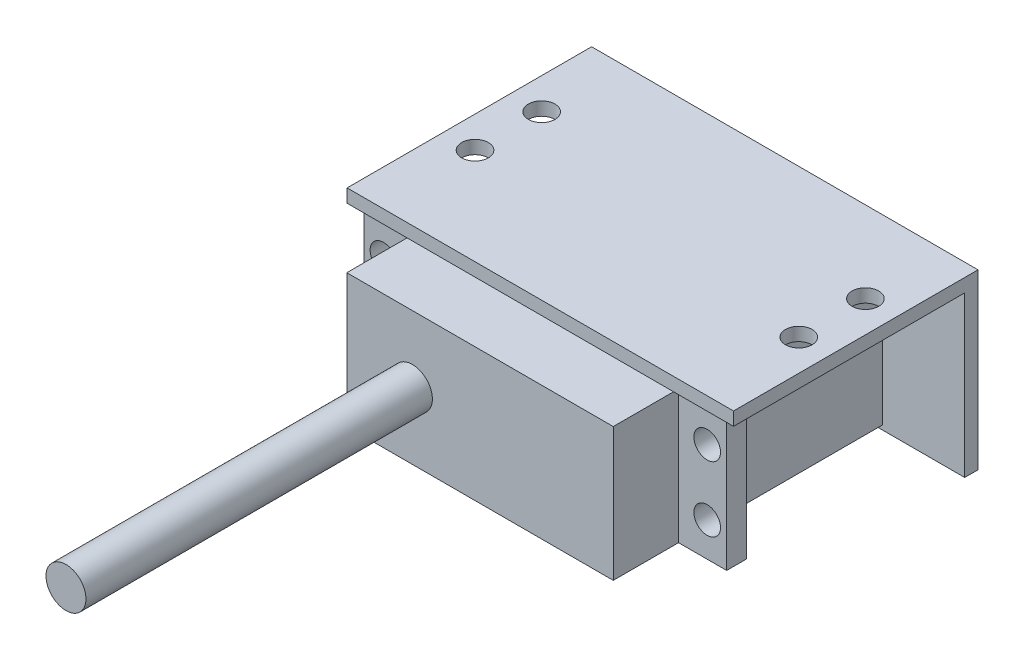
ISO-10303-21;
HEADER;
FILE_DESCRIPTION(('STEP AP214'),'2;1');
FILE_NAME('part.step','',(''),(''),'','','');
FILE_SCHEMA(('AUTOMOTIVE_DESIGN { 1 0 10303 214 1 1 1 1 }'));
ENDSEC;
DATA;
#1=APPLICATION_CONTEXT('core data for automotive mechanical design processes');
#2=APPLICATION_PROTOCOL_DEFINITION('international standard','automotive_design',2000,#1);
#3=PRODUCT_CONTEXT('',#1,'mechanical');
#4=PRODUCT('Part','Part','',(#3));
#5=PRODUCT_RELATED_PRODUCT_CATEGORY('part','',(#4));
#6=PRODUCT_DEFINITION_FORMATION('','',#4);
#7=PRODUCT_DEFINITION_CONTEXT('part definition',#1,'design');
#8=PRODUCT_DEFINITION('design','',#6,#7);
#9=PRODUCT_DEFINITION_SHAPE('','',#8);
#10=(LENGTH_UNIT() NAMED_UNIT(*) SI_UNIT(.MILLI.,.METRE.));
#11=(NAMED_UNIT(*) PLANE_ANGLE_UNIT() SI_UNIT($,.RADIAN.));
#12=(NAMED_UNIT(*) SI_UNIT($,.STERADIAN.) SOLID_ANGLE_UNIT());
#13=UNCERTAINTY_MEASURE_WITH_UNIT(LENGTH_MEASURE(1.E-05),#10,'distance_accuracy_value','');
#14=(GEOMETRIC_REPRESENTATION_CONTEXT(3) GLOBAL_UNCERTAINTY_ASSIGNED_CONTEXT((#13)) GLOBAL_UNIT_ASSIGNED_CONTEXT((#10,
#11,#12)) REPRESENTATION_CONTEXT('',''));
#15=CARTESIAN_POINT('',(0.,0.,0.));
#16=DIRECTION('',(0.,0.,1.));
#17=DIRECTION('',(1.,0.,0.));
#18=AXIS2_PLACEMENT_3D('',#15,#16,#17);
#19=CARTESIAN_POINT('',(0.,10.,0.));
#20=DIRECTION('',(0.,1.,0.));
#21=DIRECTION('',(0.,0.,1.));
#22=AXIS2_PLACEMENT_3D('',#19,#20,#21);
#23=PLANE('',#22);
#24=CARTESIAN_POINT('',(24.3,10.,-23.55));
#25=DIRECTION('',(0.,1.,0.));
#26=DIRECTION('',(0.,0.,1.));
#27=AXIS2_PLACEMENT_3D('',#24,#25,#26);
#28=CIRCLE('',#27,2.00000000000001);
#29=CARTESIAN_POINT('',(24.3,10.,-21.55));
#30=VERTEX_POINT('',#29);
#31=EDGE_CURVE('E206',#30,#30,#28,.T.);
#32=ORIENTED_EDGE('',*,*,#31,.T.);
#33=EDGE_LOOP('',(#32));
#34=FACE_BOUND('',#33,.T.);
#35=CARTESIAN_POINT('',(24.3,10.,-33.55));
#36=DIRECTION('',(0.,1.,0.));
#37=DIRECTION('',(0.,0.,1.));
#38=AXIS2_PLACEMENT_3D('',#35,#36,#37);
#39=CIRCLE('',#38,2.00000000000001);
#40=CARTESIAN_POINT('',(24.3,10.,-31.55));
#41=VERTEX_POINT('',#40);
#42=EDGE_CURVE('E210',#41,#41,#39,.T.);
#43=ORIENTED_EDGE('',*,*,#42,.T.);
#44=EDGE_LOOP('',(#43));
#45=FACE_BOUND('',#44,.T.);
#46=CARTESIAN_POINT('',(-24.3,10.,-23.55));
#47=DIRECTION('',(0.,1.,0.));
#48=DIRECTION('',(0.,0.,1.));
#49=AXIS2_PLACEMENT_3D('',#46,#47,#48);
#50=CIRCLE('',#49,2.00000000000001);
#51=CARTESIAN_POINT('',(-24.3,10.,-21.55));
#52=VERTEX_POINT('',#51);
#53=EDGE_CURVE('E216',#52,#52,#50,.T.);
#54=ORIENTED_EDGE('',*,*,#53,.T.);
#55=EDGE_LOOP('',(#54));
#56=FACE_BOUND('',#55,.T.);
#57=CARTESIAN_POINT('',(-24.3,10.,-33.55));
#58=DIRECTION('',(0.,1.,0.));
#59=DIRECTION('',(0.,0.,1.));
#60=AXIS2_PLACEMENT_3D('',#57,#58,#59);
#61=CIRCLE('',#60,2.00000000000001);
#62=CARTESIAN_POINT('',(-24.3,10.,-31.55));
#63=VERTEX_POINT('',#62);
#64=EDGE_CURVE('E222',#63,#63,#61,.T.);
#65=ORIENTED_EDGE('',*,*,#64,.T.);
#66=EDGE_LOOP('',(#65));
#67=FACE_BOUND('',#66,.T.);
#68=DIRECTION('',(-1.,0.,0.));
#69=VECTOR('',#68,1.);
#70=CARTESIAN_POINT('',(-29.,10.,-43.75));
#71=LINE('',#70,#69);
#72=CARTESIAN_POINT('',(29.,10.,-43.75));
#73=VERTEX_POINT('',#72);
#74=CARTESIAN_POINT('',(-29.,10.,-43.75));
#75=VERTEX_POINT('',#74);
#76=EDGE_CURVE('E197',#73,#75,#71,.T.);
#77=ORIENTED_EDGE('',*,*,#76,.F.);
#78=DIRECTION('',(0.,0.,-1.));
#79=VECTOR('',#78,1.);
#80=CARTESIAN_POINT('',(29.,10.,-45.75));
#81=LINE('',#80,#79);
#82=CARTESIAN_POINT('',(29.,10.,-9.05));
#83=VERTEX_POINT('',#82);
#84=EDGE_CURVE('E228',#83,#73,#81,.T.);
#85=ORIENTED_EDGE('',*,*,#84,.F.);
#86=DIRECTION('',(1.,0.,0.));
#87=VECTOR('',#86,1.);
#88=CARTESIAN_POINT('',(-29.,10.,-9.05));
#89=LINE('',#88,#87);
#90=CARTESIAN_POINT('',(20.,10.,-9.05));
#91=VERTEX_POINT('',#90);
#92=EDGE_CURVE('E53',#91,#83,#89,.T.);
#93=ORIENTED_EDGE('',*,*,#92,.F.);
#94=DIRECTION('',(0.,0.,1.));
#95=VECTOR('',#94,1.);
#96=CARTESIAN_POINT('',(20.,10.,-40.45));
#97=LINE('',#96,#95);
#98=CARTESIAN_POINT('',(20.,10.,-9.8));
#99=VERTEX_POINT('',#98);
#100=EDGE_CURVE('E370',#99,#91,#97,.T.);
#101=ORIENTED_EDGE('',*,*,#100,.F.);
#102=DIRECTION('',(1.,0.,0.));
#103=VECTOR('',#102,1.);
#104=CARTESIAN_POINT('',(0.,10.,-9.8));
#105=LINE('',#104,#103);
#106=CARTESIAN_POINT('',(27.22,10.,-9.8));
#107=VERTEX_POINT('',#106);
#108=EDGE_CURVE('E264',#99,#107,#105,.T.);
#109=ORIENTED_EDGE('',*,*,#108,.T.);
#110=DIRECTION('',(0.,0.,-1.));
#111=VECTOR('',#110,1.);
#112=CARTESIAN_POINT('',(27.22,10.,-9.8));
#113=LINE('',#112,#111);
#114=CARTESIAN_POINT('',(27.22,10.,-12.8));
#115=VERTEX_POINT('',#114);
#116=EDGE_CURVE('E275',#107,#115,#113,.T.);
#117=ORIENTED_EDGE('',*,*,#116,.T.);
#118=DIRECTION('',(1.,0.,0.));
#119=VECTOR('',#118,1.);
#120=CARTESIAN_POINT('',(0.,10.,-12.8));
#121=LINE('',#120,#119);
#122=CARTESIAN_POINT('',(20.,10.,-12.8));
#123=VERTEX_POINT('',#122);
#124=EDGE_CURVE('E281',#123,#115,#121,.T.);
#125=ORIENTED_EDGE('',*,*,#124,.F.);
#126=CARTESIAN_POINT('',(20.,10.,-40.45));
#127=VERTEX_POINT('',#126);
#128=EDGE_CURVE('E45',#127,#123,#97,.T.);
#129=ORIENTED_EDGE('',*,*,#128,.F.);
#130=DIRECTION('',(1.,0.,0.));
#131=VECTOR('',#130,1.);
#132=CARTESIAN_POINT('',(0.,10.,-40.45));
#133=LINE('',#132,#131);
#134=CARTESIAN_POINT('',(-20.,10.,-40.45));
#135=VERTEX_POINT('',#134);
#136=EDGE_CURVE('E335',#135,#127,#133,.T.);
#137=ORIENTED_EDGE('',*,*,#136,.F.);
#138=DIRECTION('',(0.,0.,1.));
#139=VECTOR('',#138,1.);
#140=CARTESIAN_POINT('',(-20.,10.,-40.45));
#141=LINE('',#140,#139);
#142=CARTESIAN_POINT('',(-20.,10.,-12.8));
#143=VERTEX_POINT('',#142);
#144=EDGE_CURVE('E361',#135,#143,#141,.T.);
#145=ORIENTED_EDGE('',*,*,#144,.T.);
#146=DIRECTION('',(1.,0.,0.));
#147=VECTOR('',#146,1.);
#148=CARTESIAN_POINT('',(0.,10.,-12.8));
#149=LINE('',#148,#147);
#150=CARTESIAN_POINT('',(-27.22,10.,-12.8));
#151=VERTEX_POINT('',#150);
#152=EDGE_CURVE('E322',#151,#143,#149,.T.);
#153=ORIENTED_EDGE('',*,*,#152,.F.);
#154=DIRECTION('',(0.,0.,-1.));
#155=VECTOR('',#154,1.);
#156=CARTESIAN_POINT('',(-27.22,10.,-9.8));
#157=LINE('',#156,#155);
#158=CARTESIAN_POINT('',(-27.22,10.,-9.8));
#159=VERTEX_POINT('',#158);
#160=EDGE_CURVE('E330',#159,#151,#157,.T.);
#161=ORIENTED_EDGE('',*,*,#160,.F.);
#162=DIRECTION('',(1.,0.,0.));
#163=VECTOR('',#162,1.);
#164=CARTESIAN_POINT('',(0.,10.,-9.8));
#165=LINE('',#164,#163);
#166=CARTESIAN_POINT('',(-20.,10.,-9.8));
#167=VERTEX_POINT('',#166);
#168=EDGE_CURVE('E305',#159,#167,#165,.T.);
#169=ORIENTED_EDGE('',*,*,#168,.T.);
#170=CARTESIAN_POINT('',(-20.,10.,-9.05));
#171=VERTEX_POINT('',#170);
#172=EDGE_CURVE('E363',#167,#171,#141,.T.);
#173=ORIENTED_EDGE('',*,*,#172,.T.);
#174=CARTESIAN_POINT('',(-29.,10.,-9.05));
#175=VERTEX_POINT('',#174);
#176=EDGE_CURVE('E52',#175,#171,#89,.T.);
#177=ORIENTED_EDGE('',*,*,#176,.F.);
#178=DIRECTION('',(0.,0.,1.));
#179=VECTOR('',#178,1.);
#180=CARTESIAN_POINT('',(-29.,10.,-45.75));
#181=LINE('',#180,#179);
#182=EDGE_CURVE('E242',#75,#175,#181,.T.);
#183=ORIENTED_EDGE('',*,*,#182,.F.);
#184=EDGE_LOOP('',(#77,#85,#93,#101,#109,#117,#125,#129,#137,#145,#153,#161,#169,#173,#177,#183));
#185=FACE_BOUND('',#184,.T.);
#186=ADVANCED_FACE('F41',(#34,#45,#56,#67,#185),#23,.F.);
#187=CARTESIAN_POINT('',(0.,10.,-40.45));
#188=DIRECTION('',(0.,-1.,0.));
#189=DIRECTION('',(0.,0.,-1.));
#190=AXIS2_PLACEMENT_3D('',#187,#188,#189);
#191=PLANE('',#190);
#192=EDGE_CURVE('E11',#171,#91,#89,.T.);
#193=ORIENTED_EDGE('',*,*,#192,.F.);
#194=CARTESIAN_POINT('',(-20.,10.,0.));
#195=VERTEX_POINT('',#194);
#196=EDGE_CURVE('E364',#171,#195,#141,.T.);
#197=ORIENTED_EDGE('',*,*,#196,.T.);
#198=DIRECTION('',(1.,0.,0.));
#199=VECTOR('',#198,1.);
#200=CARTESIAN_POINT('',(0.,10.,0.));
#201=LINE('',#200,#199);
#202=CARTESIAN_POINT('',(20.,10.,0.));
#203=VERTEX_POINT('',#202);
#204=EDGE_CURVE('E347',#195,#203,#201,.T.);
#205=ORIENTED_EDGE('',*,*,#204,.T.);
#206=EDGE_CURVE('E344',#91,#203,#97,.T.);
#207=ORIENTED_EDGE('',*,*,#206,.F.);
#208=EDGE_LOOP('',(#193,#197,#205,#207));
#209=FACE_BOUND('',#208,.T.);
#210=ADVANCED_FACE('F380',(#209),#191,.F.);
#211=CARTESIAN_POINT('',(20.,0.,-40.45));
#212=DIRECTION('',(-1.,0.,0.));
#213=DIRECTION('',(0.,0.,1.));
#214=AXIS2_PLACEMENT_3D('',#211,#212,#213);
#215=PLANE('',#214);
#216=DIRECTION('',(0.,-1.,0.));
#217=VECTOR('',#216,1.);
#218=CARTESIAN_POINT('',(20.,0.,-9.8));
#219=LINE('',#218,#217);
#220=CARTESIAN_POINT('',(20.,-10.,-9.8));
#221=VERTEX_POINT('',#220);
#222=EDGE_CURVE('E267',#99,#221,#219,.T.);
#223=ORIENTED_EDGE('',*,*,#222,.F.);
#224=ORIENTED_EDGE('',*,*,#100,.T.);
#225=ORIENTED_EDGE('',*,*,#206,.T.);
#226=DIRECTION('',(0.,-1.,0.));
#227=VECTOR('',#226,1.);
#228=CARTESIAN_POINT('',(20.,0.,0.));
#229=LINE('',#228,#227);
#230=CARTESIAN_POINT('',(20.,-10.,0.));
#231=VERTEX_POINT('',#230);
#232=EDGE_CURVE('E332',#203,#231,#229,.T.);
#233=ORIENTED_EDGE('',*,*,#232,.T.);
#234=DIRECTION('',(0.,0.,1.));
#235=VECTOR('',#234,1.);
#236=CARTESIAN_POINT('',(20.,-10.,-40.45));
#237=LINE('',#236,#235);
#238=EDGE_CURVE('E357',#221,#231,#237,.T.);
#239=ORIENTED_EDGE('',*,*,#238,.F.);
#240=EDGE_LOOP('',(#223,#224,#225,#233,#239));
#241=FACE_BOUND('',#240,.T.);
#242=ADVANCED_FACE('F376',(#241),#215,.F.);
#243=CARTESIAN_POINT('',(-20.,0.,-40.45));
#244=DIRECTION('',(-1.,0.,0.));
#245=DIRECTION('',(0.,0.,1.));
#246=AXIS2_PLACEMENT_3D('',#243,#244,#245);
#247=PLANE('',#246);
#248=ORIENTED_EDGE('',*,*,#172,.F.);
#249=DIRECTION('',(0.,-1.,0.));
#250=VECTOR('',#249,1.);
#251=CARTESIAN_POINT('',(-20.,0.,-9.8));
#252=LINE('',#251,#250);
#253=CARTESIAN_POINT('',(-20.,-10.,-9.8));
#254=VERTEX_POINT('',#253);
#255=EDGE_CURVE('E302',#167,#254,#252,.T.);
#256=ORIENTED_EDGE('',*,*,#255,.T.);
#257=DIRECTION('',(0.,0.,1.));
#258=VECTOR('',#257,1.);
#259=CARTESIAN_POINT('',(-20.,-10.,-40.45));
#260=LINE('',#259,#258);
#261=CARTESIAN_POINT('',(-20.,-10.,0.));
#262=VERTEX_POINT('',#261);
#263=EDGE_CURVE('E360',#254,#262,#260,.T.);
#264=ORIENTED_EDGE('',*,*,#263,.T.);
#265=DIRECTION('',(0.,-1.,0.));
#266=VECTOR('',#265,1.);
#267=CARTESIAN_POINT('',(-20.,0.,0.));
#268=LINE('',#267,#266);
#269=EDGE_CURVE('E350',#195,#262,#268,.T.);
#270=ORIENTED_EDGE('',*,*,#269,.F.);
#271=ORIENTED_EDGE('',*,*,#196,.F.);
#272=EDGE_LOOP('',(#248,#256,#264,#270,#271));
#273=FACE_BOUND('',#272,.T.);
#274=ADVANCED_FACE('F406',(#273),#247,.T.);
#275=ORIENTED_EDGE('',*,*,#128,.T.);
#276=DIRECTION('',(0.,-1.,0.));
#277=VECTOR('',#276,1.);
#278=CARTESIAN_POINT('',(20.,0.,-12.8));
#279=LINE('',#278,#277);
#280=CARTESIAN_POINT('',(20.,-10.,-12.8));
#281=VERTEX_POINT('',#280);
#282=EDGE_CURVE('E283',#123,#281,#279,.T.);
#283=ORIENTED_EDGE('',*,*,#282,.T.);
#284=CARTESIAN_POINT('',(20.,-10.,-40.45));
#285=VERTEX_POINT('',#284);
#286=EDGE_CURVE('E50',#285,#281,#237,.T.);
#287=ORIENTED_EDGE('',*,*,#286,.F.);
#288=DIRECTION('',(0.,-1.,0.));
#289=VECTOR('',#288,1.);
#290=CARTESIAN_POINT('',(20.,0.,-40.45));
#291=LINE('',#290,#289);
#292=EDGE_CURVE('E333',#127,#285,#291,.T.);
#293=ORIENTED_EDGE('',*,*,#292,.F.);
#294=EDGE_LOOP('',(#275,#283,#287,#293));
#295=FACE_BOUND('',#294,.T.);
#296=ADVANCED_FACE('F43',(#295),#215,.F.);
#297=CARTESIAN_POINT('',(0.,-10.,-40.45));
#298=DIRECTION('',(0.,-1.,0.));
#299=DIRECTION('',(0.,0.,-1.));
#300=AXIS2_PLACEMENT_3D('',#297,#298,#299);
#301=PLANE('',#300);
#302=DIRECTION('',(1.,0.,0.));
#303=VECTOR('',#302,1.);
#304=CARTESIAN_POINT('',(0.,-10.,0.));
#305=LINE('',#304,#303);
#306=EDGE_CURVE('E336',#262,#231,#305,.T.);
#307=ORIENTED_EDGE('',*,*,#306,.F.);
#308=ORIENTED_EDGE('',*,*,#263,.F.);
#309=DIRECTION('',(1.,0.,0.));
#310=VECTOR('',#309,1.);
#311=CARTESIAN_POINT('',(0.,-10.,-9.8));
#312=LINE('',#311,#310);
#313=CARTESIAN_POINT('',(-27.22,-10.,-9.8));
#314=VERTEX_POINT('',#313);
#315=EDGE_CURVE('E311',#314,#254,#312,.T.);
#316=ORIENTED_EDGE('',*,*,#315,.F.);
#317=DIRECTION('',(0.,0.,-1.));
#318=VECTOR('',#317,1.);
#319=CARTESIAN_POINT('',(-27.22,-10.,-9.8));
#320=LINE('',#319,#318);
#321=CARTESIAN_POINT('',(-27.22,-10.,-12.8));
#322=VERTEX_POINT('',#321);
#323=EDGE_CURVE('E313',#314,#322,#320,.T.);
#324=ORIENTED_EDGE('',*,*,#323,.T.);
#325=DIRECTION('',(1.,0.,0.));
#326=VECTOR('',#325,1.);
#327=CARTESIAN_POINT('',(0.,-10.,-12.8));
#328=LINE('',#327,#326);
#329=CARTESIAN_POINT('',(-20.,-10.,-12.8));
#330=VERTEX_POINT('',#329);
#331=EDGE_CURVE('E299',#322,#330,#328,.T.);
#332=ORIENTED_EDGE('',*,*,#331,.T.);
#333=CARTESIAN_POINT('',(-20.,-10.,-40.45));
#334=VERTEX_POINT('',#333);
#335=EDGE_CURVE('E358',#334,#330,#260,.T.);
#336=ORIENTED_EDGE('',*,*,#335,.F.);
#337=DIRECTION('',(1.,0.,0.));
#338=VECTOR('',#337,1.);
#339=CARTESIAN_POINT('',(0.,-10.,-40.45));
#340=LINE('',#339,#338);
#341=EDGE_CURVE('E341',#334,#285,#340,.T.);
#342=ORIENTED_EDGE('',*,*,#341,.T.);
#343=ORIENTED_EDGE('',*,*,#286,.T.);
#344=DIRECTION('',(1.,0.,0.));
#345=VECTOR('',#344,1.);
#346=CARTESIAN_POINT('',(0.,-10.,-12.8));
#347=LINE('',#346,#345);
#348=CARTESIAN_POINT('',(27.22,-10.,-12.8));
#349=VERTEX_POINT('',#348);
#350=EDGE_CURVE('E285',#281,#349,#347,.T.);
#351=ORIENTED_EDGE('',*,*,#350,.T.);
#352=DIRECTION('',(0.,0.,-1.));
#353=VECTOR('',#352,1.);
#354=CARTESIAN_POINT('',(27.22,-10.,-9.8));
#355=LINE('',#354,#353);
#356=CARTESIAN_POINT('',(27.22,-10.,-9.8));
#357=VERTEX_POINT('',#356);
#358=EDGE_CURVE('E292',#357,#349,#355,.T.);
#359=ORIENTED_EDGE('',*,*,#358,.F.);
#360=DIRECTION('',(1.,0.,0.));
#361=VECTOR('',#360,1.);
#362=CARTESIAN_POINT('',(0.,-10.,-9.8));
#363=LINE('',#362,#361);
#364=EDGE_CURVE('E270',#221,#357,#363,.T.);
#365=ORIENTED_EDGE('',*,*,#364,.F.);
#366=ORIENTED_EDGE('',*,*,#238,.T.);
#367=EDGE_LOOP('',(#307,#308,#316,#324,#332,#336,#342,#343,#351,#359,#365,#366));
#368=FACE_BOUND('',#367,.T.);
#369=ADVANCED_FACE('F387',(#368),#301,.T.);
#370=DIRECTION('',(0.,-1.,0.));
#371=VECTOR('',#370,1.);
#372=CARTESIAN_POINT('',(-20.,0.,-12.8));
#373=LINE('',#372,#371);
#374=EDGE_CURVE('E319',#143,#330,#373,.T.);
#375=ORIENTED_EDGE('',*,*,#374,.F.);
#376=ORIENTED_EDGE('',*,*,#144,.F.);
#377=DIRECTION('',(0.,-1.,0.));
#378=VECTOR('',#377,1.);
#379=CARTESIAN_POINT('',(-20.,0.,-40.45));
#380=LINE('',#379,#378);
#381=EDGE_CURVE('E338',#135,#334,#380,.T.);
#382=ORIENTED_EDGE('',*,*,#381,.T.);
#383=ORIENTED_EDGE('',*,*,#335,.T.);
#384=EDGE_LOOP('',(#375,#376,#382,#383));
#385=FACE_BOUND('',#384,.T.);
#386=ADVANCED_FACE('F417',(#385),#247,.T.);
#387=CARTESIAN_POINT('',(0.,0.,-40.45));
#388=DIRECTION('',(0.,0.,1.));
#389=DIRECTION('',(1.,0.,0.));
#390=AXIS2_PLACEMENT_3D('',#387,#388,#389);
#391=PLANE('',#390);
#392=ORIENTED_EDGE('',*,*,#292,.T.);
#393=ORIENTED_EDGE('',*,*,#341,.F.);
#394=ORIENTED_EDGE('',*,*,#381,.F.);
#395=ORIENTED_EDGE('',*,*,#136,.T.);
#396=EDGE_LOOP('',(#392,#393,#394,#395));
#397=FACE_BOUND('',#396,.T.);
#398=ADVANCED_FACE('F423',(#397),#391,.F.);
#399=CARTESIAN_POINT('',(0.,0.,0.));
#400=DIRECTION('',(0.,0.,1.));
#401=DIRECTION('',(1.,0.,0.));
#402=AXIS2_PLACEMENT_3D('',#399,#400,#401);
#403=PLANE('',#402);
#404=CARTESIAN_POINT('',(-10.15,0.,0.));
#405=DIRECTION('',(0.,0.,1.));
#406=DIRECTION('',(1.,0.,0.));
#407=AXIS2_PLACEMENT_3D('',#404,#405,#406);
#408=CIRCLE('',#407,3.);
#409=CARTESIAN_POINT('',(-13.15,0.,0.));
#410=VERTEX_POINT('',#409);
#411=EDGE_CURVE('E250',#410,#410,#408,.T.);
#412=ORIENTED_EDGE('',*,*,#411,.F.);
#413=EDGE_LOOP('',(#412));
#414=FACE_BOUND('',#413,.T.);
#415=ORIENTED_EDGE('',*,*,#232,.F.);
#416=ORIENTED_EDGE('',*,*,#204,.F.);
#417=ORIENTED_EDGE('',*,*,#269,.T.);
#418=ORIENTED_EDGE('',*,*,#306,.T.);
#419=EDGE_LOOP('',(#415,#416,#417,#418));
#420=FACE_BOUND('',#419,.T.);
#421=ADVANCED_FACE('F383',(#414,#420),#403,.T.);
#422=CARTESIAN_POINT('',(-27.22,0.,-9.8));
#423=DIRECTION('',(1.,0.,0.));
#424=DIRECTION('',(0.,0.,-1.));
#425=AXIS2_PLACEMENT_3D('',#422,#423,#424);
#426=PLANE('',#425);
#427=DIRECTION('',(0.,-1.,0.));
#428=VECTOR('',#427,1.);
#429=CARTESIAN_POINT('',(-27.22,0.,-12.8));
#430=LINE('',#429,#428);
#431=EDGE_CURVE('E324',#151,#322,#430,.T.);
#432=ORIENTED_EDGE('',*,*,#431,.T.);
#433=ORIENTED_EDGE('',*,*,#323,.F.);
#434=DIRECTION('',(0.,-1.,0.));
#435=VECTOR('',#434,1.);
#436=CARTESIAN_POINT('',(-27.22,0.,-9.8));
#437=LINE('',#436,#435);
#438=EDGE_CURVE('E308',#159,#314,#437,.T.);
#439=ORIENTED_EDGE('',*,*,#438,.F.);
#440=ORIENTED_EDGE('',*,*,#160,.T.);
#441=EDGE_LOOP('',(#432,#433,#439,#440));
#442=FACE_BOUND('',#441,.T.);
#443=ADVANCED_FACE('F412',(#442),#426,.F.);
#444=CARTESIAN_POINT('',(-24.3,4.9,-9.8));
#445=DIRECTION('',(0.,0.,-1.));
#446=DIRECTION('',(-1.,0.,0.));
#447=AXIS2_PLACEMENT_3D('',#444,#445,#446);
#448=CYLINDRICAL_SURFACE('',#447,2.);
#449=CARTESIAN_POINT('',(-24.3,4.9,-9.8));
#450=DIRECTION('',(0.,0.,1.));
#451=DIRECTION('',(1.,0.,0.));
#452=AXIS2_PLACEMENT_3D('',#449,#450,#451);
#453=CIRCLE('',#452,2.);
#454=CARTESIAN_POINT('',(-22.3,4.9,-9.8));
#455=VERTEX_POINT('',#454);
#456=EDGE_CURVE('E298',#455,#455,#453,.T.);
#457=ORIENTED_EDGE('',*,*,#456,.T.);
#458=EDGE_LOOP('',(#457));
#459=FACE_BOUND('',#458,.T.);
#460=CARTESIAN_POINT('',(-24.3,4.9,-12.8));
#461=DIRECTION('',(0.,0.,1.));
#462=DIRECTION('',(1.,0.,0.));
#463=AXIS2_PLACEMENT_3D('',#460,#461,#462);
#464=CIRCLE('',#463,2.);
#465=CARTESIAN_POINT('',(-22.3,4.9,-12.8));
#466=VERTEX_POINT('',#465);
#467=EDGE_CURVE('E316',#466,#466,#464,.T.);
#468=ORIENTED_EDGE('',*,*,#467,.F.);
#469=EDGE_LOOP('',(#468));
#470=FACE_BOUND('',#469,.T.);
#471=ADVANCED_FACE('F498',(#459,#470),#448,.F.);
#472=CARTESIAN_POINT('',(-24.3,-4.9,-9.8));
#473=DIRECTION('',(0.,0.,-1.));
#474=DIRECTION('',(-1.,0.,0.));
#475=AXIS2_PLACEMENT_3D('',#472,#473,#474);
#476=CYLINDRICAL_SURFACE('',#475,2.);
#477=CARTESIAN_POINT('',(-24.3,-4.9,-9.8));
#478=DIRECTION('',(0.,0.,1.));
#479=DIRECTION('',(1.,0.,0.));
#480=AXIS2_PLACEMENT_3D('',#477,#478,#479);
#481=CIRCLE('',#480,2.);
#482=CARTESIAN_POINT('',(-22.3,-4.9,-9.8));
#483=VERTEX_POINT('',#482);
#484=EDGE_CURVE('E295',#483,#483,#481,.T.);
#485=ORIENTED_EDGE('',*,*,#484,.T.);
#486=EDGE_LOOP('',(#485));
#487=FACE_BOUND('',#486,.T.);
#488=CARTESIAN_POINT('',(-24.3,-4.9,-12.8));
#489=DIRECTION('',(0.,0.,1.));
#490=DIRECTION('',(1.,0.,0.));
#491=AXIS2_PLACEMENT_3D('',#488,#489,#490);
#492=CIRCLE('',#491,2.);
#493=CARTESIAN_POINT('',(-22.3,-4.9,-12.8));
#494=VERTEX_POINT('',#493);
#495=EDGE_CURVE('E294',#494,#494,#492,.T.);
#496=ORIENTED_EDGE('',*,*,#495,.F.);
#497=EDGE_LOOP('',(#496));
#498=FACE_BOUND('',#497,.T.);
#499=ADVANCED_FACE('F493',(#487,#498),#476,.F.);
#500=CARTESIAN_POINT('',(0.,0.,-9.8));
#501=DIRECTION('',(0.,0.,1.));
#502=DIRECTION('',(1.,0.,0.));
#503=AXIS2_PLACEMENT_3D('',#500,#501,#502);
#504=PLANE('',#503);
#505=ORIENTED_EDGE('',*,*,#484,.F.);
#506=EDGE_LOOP('',(#505));
#507=FACE_BOUND('',#506,.T.);
#508=ORIENTED_EDGE('',*,*,#456,.F.);
#509=EDGE_LOOP('',(#508));
#510=FACE_BOUND('',#509,.T.);
#511=ORIENTED_EDGE('',*,*,#255,.F.);
#512=ORIENTED_EDGE('',*,*,#168,.F.);
#513=ORIENTED_EDGE('',*,*,#438,.T.);
#514=ORIENTED_EDGE('',*,*,#315,.T.);
#515=EDGE_LOOP('',(#511,#512,#513,#514));
#516=FACE_BOUND('',#515,.T.);
#517=ADVANCED_FACE('F408',(#507,#510,#516),#504,.T.);
#518=CARTESIAN_POINT('',(0.,0.,-12.8));
#519=DIRECTION('',(0.,0.,1.));
#520=DIRECTION('',(1.,0.,0.));
#521=AXIS2_PLACEMENT_3D('',#518,#519,#520);
#522=PLANE('',#521);
#523=ORIENTED_EDGE('',*,*,#495,.T.);
#524=EDGE_LOOP('',(#523));
#525=FACE_BOUND('',#524,.T.);
#526=ORIENTED_EDGE('',*,*,#467,.T.);
#527=EDGE_LOOP('',(#526));
#528=FACE_BOUND('',#527,.T.);
#529=ORIENTED_EDGE('',*,*,#374,.T.);
#530=ORIENTED_EDGE('',*,*,#331,.F.);
#531=ORIENTED_EDGE('',*,*,#431,.F.);
#532=ORIENTED_EDGE('',*,*,#152,.T.);
#533=EDGE_LOOP('',(#529,#530,#531,#532));
#534=FACE_BOUND('',#533,.T.);
#535=ADVANCED_FACE('F414',(#525,#528,#534),#522,.F.);
#536=CARTESIAN_POINT('',(24.3,4.9,-9.8));
#537=DIRECTION('',(0.,0.,-1.));
#538=DIRECTION('',(-1.,0.,0.));
#539=AXIS2_PLACEMENT_3D('',#536,#537,#538);
#540=CYLINDRICAL_SURFACE('',#539,2.);
#541=CARTESIAN_POINT('',(24.3,4.9,-9.8));
#542=DIRECTION('',(0.,0.,1.));
#543=DIRECTION('',(1.,0.,0.));
#544=AXIS2_PLACEMENT_3D('',#541,#542,#543);
#545=CIRCLE('',#544,2.);
#546=CARTESIAN_POINT('',(26.3,4.9,-9.8));
#547=VERTEX_POINT('',#546);
#548=EDGE_CURVE('E260',#547,#547,#545,.T.);
#549=ORIENTED_EDGE('',*,*,#548,.T.);
#550=EDGE_LOOP('',(#549));
#551=FACE_BOUND('',#550,.T.);
#552=CARTESIAN_POINT('',(24.3,4.9,-12.8));
#553=DIRECTION('',(0.,0.,1.));
#554=DIRECTION('',(1.,0.,0.));
#555=AXIS2_PLACEMENT_3D('',#552,#553,#554);
#556=CIRCLE('',#555,2.);
#557=CARTESIAN_POINT('',(26.3,4.9,-12.8));
#558=VERTEX_POINT('',#557);
#559=EDGE_CURVE('E278',#558,#558,#556,.T.);
#560=ORIENTED_EDGE('',*,*,#559,.F.);
#561=EDGE_LOOP('',(#560));
#562=FACE_BOUND('',#561,.T.);
#563=ADVANCED_FACE('F440',(#551,#562),#540,.F.);
#564=CARTESIAN_POINT('',(24.3,-4.9,-9.8));
#565=DIRECTION('',(0.,0.,-1.));
#566=DIRECTION('',(-1.,0.,0.));
#567=AXIS2_PLACEMENT_3D('',#564,#565,#566);
#568=CYLINDRICAL_SURFACE('',#567,2.);
#569=CARTESIAN_POINT('',(24.3,-4.9,-9.8));
#570=DIRECTION('',(0.,0.,1.));
#571=DIRECTION('',(1.,0.,0.));
#572=AXIS2_PLACEMENT_3D('',#569,#570,#571);
#573=CIRCLE('',#572,2.);
#574=CARTESIAN_POINT('',(26.3,-4.9,-9.8));
#575=VERTEX_POINT('',#574);
#576=EDGE_CURVE('E257',#575,#575,#573,.T.);
#577=ORIENTED_EDGE('',*,*,#576,.T.);
#578=EDGE_LOOP('',(#577));
#579=FACE_BOUND('',#578,.T.);
#580=CARTESIAN_POINT('',(24.3,-4.9,-12.8));
#581=DIRECTION('',(0.,0.,1.));
#582=DIRECTION('',(1.,0.,0.));
#583=AXIS2_PLACEMENT_3D('',#580,#581,#582);
#584=CIRCLE('',#583,2.);
#585=CARTESIAN_POINT('',(26.3,-4.9,-12.8));
#586=VERTEX_POINT('',#585);
#587=EDGE_CURVE('E254',#586,#586,#584,.T.);
#588=ORIENTED_EDGE('',*,*,#587,.F.);
#589=EDGE_LOOP('',(#588));
#590=FACE_BOUND('',#589,.T.);
#591=ADVANCED_FACE('F431',(#579,#590),#568,.F.);
#592=CARTESIAN_POINT('',(27.22,0.,-9.8));
#593=DIRECTION('',(1.,0.,0.));
#594=DIRECTION('',(0.,1.,0.));
#595=AXIS2_PLACEMENT_3D('',#592,#593,#594);
#596=PLANE('',#595);
#597=DIRECTION('',(0.,-1.,0.));
#598=VECTOR('',#597,1.);
#599=CARTESIAN_POINT('',(27.22,0.,-12.8));
#600=LINE('',#599,#598);
#601=EDGE_CURVE('E261',#115,#349,#600,.T.);
#602=ORIENTED_EDGE('',*,*,#601,.F.);
#603=ORIENTED_EDGE('',*,*,#116,.F.);
#604=DIRECTION('',(0.,-1.,0.));
#605=VECTOR('',#604,1.);
#606=CARTESIAN_POINT('',(27.22,0.,-9.8));
#607=LINE('',#606,#605);
#608=EDGE_CURVE('E272',#107,#357,#607,.T.);
#609=ORIENTED_EDGE('',*,*,#608,.T.);
#610=ORIENTED_EDGE('',*,*,#358,.T.);
#611=EDGE_LOOP('',(#602,#603,#609,#610));
#612=FACE_BOUND('',#611,.T.);
#613=ADVANCED_FACE('F429',(#612),#596,.T.);
#614=CARTESIAN_POINT('',(0.,0.,-9.8));
#615=DIRECTION('',(0.,0.,1.));
#616=DIRECTION('',(1.,0.,0.));
#617=AXIS2_PLACEMENT_3D('',#614,#615,#616);
#618=PLANE('',#617);
#619=ORIENTED_EDGE('',*,*,#576,.F.);
#620=EDGE_LOOP('',(#619));
#621=FACE_BOUND('',#620,.T.);
#622=ORIENTED_EDGE('',*,*,#548,.F.);
#623=EDGE_LOOP('',(#622));
#624=FACE_BOUND('',#623,.T.);
#625=ORIENTED_EDGE('',*,*,#108,.F.);
#626=ORIENTED_EDGE('',*,*,#222,.T.);
#627=ORIENTED_EDGE('',*,*,#364,.T.);
#628=ORIENTED_EDGE('',*,*,#608,.F.);
#629=EDGE_LOOP('',(#625,#626,#627,#628));
#630=FACE_BOUND('',#629,.T.);
#631=ADVANCED_FACE('F393',(#621,#624,#630),#618,.T.);
#632=CARTESIAN_POINT('',(0.,0.,-12.8));
#633=DIRECTION('',(0.,0.,1.));
#634=DIRECTION('',(1.,0.,0.));
#635=AXIS2_PLACEMENT_3D('',#632,#633,#634);
#636=PLANE('',#635);
#637=ORIENTED_EDGE('',*,*,#587,.T.);
#638=EDGE_LOOP('',(#637));
#639=FACE_BOUND('',#638,.T.);
#640=ORIENTED_EDGE('',*,*,#559,.T.);
#641=EDGE_LOOP('',(#640));
#642=FACE_BOUND('',#641,.T.);
#643=ORIENTED_EDGE('',*,*,#124,.T.);
#644=ORIENTED_EDGE('',*,*,#601,.T.);
#645=ORIENTED_EDGE('',*,*,#350,.F.);
#646=ORIENTED_EDGE('',*,*,#282,.F.);
#647=EDGE_LOOP('',(#643,#644,#645,#646));
#648=FACE_BOUND('',#647,.T.);
#649=ADVANCED_FACE('F426',(#639,#642,#648),#636,.F.);
#650=CARTESIAN_POINT('',(-10.15,0.,52.));
#651=DIRECTION('',(0.,0.,-1.));
#652=DIRECTION('',(-1.,0.,0.));
#653=AXIS2_PLACEMENT_3D('',#650,#651,#652);
#654=CYLINDRICAL_SURFACE('',#653,3.);
#655=CARTESIAN_POINT('',(-10.15,0.,52.));
#656=DIRECTION('',(0.,0.,1.));
#657=DIRECTION('',(1.,0.,0.));
#658=AXIS2_PLACEMENT_3D('',#655,#656,#657);
#659=CIRCLE('',#658,3.);
#660=CARTESIAN_POINT('',(-13.15,0.,52.));
#661=VERTEX_POINT('',#660);
#662=EDGE_CURVE('E251',#661,#661,#659,.T.);
#663=CARTESIAN_POINT('',(-13.15,0.,52.));
#664=CARTESIAN_POINT('',(-13.15,0.,51.4583333333333));
#665=CARTESIAN_POINT('',(-13.15,0.,50.9166666666667));
#666=CARTESIAN_POINT('',(-13.15,0.,49.8333333333333));
#667=CARTESIAN_POINT('',(-13.15,0.,49.2916666666667));
#668=CARTESIAN_POINT('',(-13.15,0.,48.2083333333333));
#669=CARTESIAN_POINT('',(-13.15,0.,47.6666666666667));
#670=CARTESIAN_POINT('',(-13.15,0.,46.5833333333333));
#671=CARTESIAN_POINT('',(-13.15,0.,46.0416666666667));
#672=CARTESIAN_POINT('',(-13.15,0.,44.9583333333333));
#673=CARTESIAN_POINT('',(-13.15,0.,44.4166666666667));
#674=CARTESIAN_POINT('',(-13.15,0.,43.3333333333333));
#675=CARTESIAN_POINT('',(-13.15,0.,42.7916666666667));
#676=CARTESIAN_POINT('',(-13.15,0.,41.7083333333333));
#677=CARTESIAN_POINT('',(-13.15,0.,41.1666666666667));
#678=CARTESIAN_POINT('',(-13.15,0.,40.0833333333333));
#679=CARTESIAN_POINT('',(-13.15,0.,39.5416666666667));
#680=CARTESIAN_POINT('',(-13.15,0.,38.4583333333333));
#681=CARTESIAN_POINT('',(-13.15,0.,37.9166666666667));
#682=CARTESIAN_POINT('',(-13.15,0.,36.8333333333333));
#683=CARTESIAN_POINT('',(-13.15,0.,36.2916666666667));
#684=CARTESIAN_POINT('',(-13.15,0.,35.2083333333333));
#685=CARTESIAN_POINT('',(-13.15,0.,34.6666666666667));
#686=CARTESIAN_POINT('',(-13.15,0.,33.5833333333333));
#687=CARTESIAN_POINT('',(-13.15,0.,33.0416666666667));
#688=CARTESIAN_POINT('',(-13.15,0.,31.9583333333333));
#689=CARTESIAN_POINT('',(-13.15,0.,31.4166666666667));
#690=CARTESIAN_POINT('',(-13.15,0.,30.3333333333333));
#691=CARTESIAN_POINT('',(-13.15,0.,29.7916666666667));
#692=CARTESIAN_POINT('',(-13.15,0.,28.7083333333333));
#693=CARTESIAN_POINT('',(-13.15,0.,28.1666666666667));
#694=CARTESIAN_POINT('',(-13.15,0.,27.0833333333333));
#695=CARTESIAN_POINT('',(-13.15,0.,26.5416666666667));
#696=CARTESIAN_POINT('',(-13.15,0.,25.4583333333333));
#697=CARTESIAN_POINT('',(-13.15,0.,24.9166666666667));
#698=CARTESIAN_POINT('',(-13.15,0.,23.8333333333333));
#699=CARTESIAN_POINT('',(-13.15,0.,23.2916666666667));
#700=CARTESIAN_POINT('',(-13.15,0.,22.2083333333333));
#701=CARTESIAN_POINT('',(-13.15,0.,21.6666666666667));
#702=CARTESIAN_POINT('',(-13.15,0.,20.5833333333333));
#703=CARTESIAN_POINT('',(-13.15,0.,20.0416666666667));
#704=CARTESIAN_POINT('',(-13.15,0.,18.9583333333333));
#705=CARTESIAN_POINT('',(-13.15,0.,18.4166666666667));
#706=CARTESIAN_POINT('',(-13.15,0.,17.3333333333333));
#707=CARTESIAN_POINT('',(-13.15,0.,16.7916666666667));
#708=CARTESIAN_POINT('',(-13.15,0.,15.7083333333333));
#709=CARTESIAN_POINT('',(-13.15,0.,15.1666666666667));
#710=CARTESIAN_POINT('',(-13.15,0.,14.0833333333333));
#711=CARTESIAN_POINT('',(-13.15,0.,13.5416666666667));
#712=CARTESIAN_POINT('',(-13.15,0.,12.4583333333333));
#713=CARTESIAN_POINT('',(-13.15,0.,11.9166666666667));
#714=CARTESIAN_POINT('',(-13.15,0.,10.8333333333333));
#715=CARTESIAN_POINT('',(-13.15,0.,10.2916666666667));
#716=CARTESIAN_POINT('',(-13.15,0.,9.20833333333333));
#717=CARTESIAN_POINT('',(-13.15,0.,8.66666666666667));
#718=CARTESIAN_POINT('',(-13.15,0.,7.58333333333333));
#719=CARTESIAN_POINT('',(-13.15,0.,7.04166666666667));
#720=CARTESIAN_POINT('',(-13.15,0.,5.95833333333333));
#721=CARTESIAN_POINT('',(-13.15,0.,5.41666666666667));
#722=CARTESIAN_POINT('',(-13.15,0.,4.33333333333333));
#723=CARTESIAN_POINT('',(-13.15,0.,3.79166666666667));
#724=CARTESIAN_POINT('',(-13.15,0.,2.70833333333334));
#725=CARTESIAN_POINT('',(-13.15,0.,2.16666666666667));
#726=CARTESIAN_POINT('',(-13.15,0.,1.08333333333333));
#727=CARTESIAN_POINT('',(-13.15,0.,0.541666666666667));
#728=CARTESIAN_POINT('',(-13.15,0.,0.));
#729=B_SPLINE_CURVE_WITH_KNOTS('',3,(#663,#664,#665,#666,#667,#668,#669,#670,#671,#672,#673,
#674,#675,#676,#677,#678,#679,#680,#681,#682,#683,#684,#685,#686,#687,#688,#689,#690,#691,#692,
#693,#694,#695,#696,#697,#698,#699,#700,#701,#702,#703,#704,#705,#706,#707,#708,#709,#710,#711,
#712,#713,#714,#715,#716,#717,#718,#719,#720,#721,#722,#723,#724,#725,#726,#727,#728),
.UNSPECIFIED.,.F.,.F.,(4,2,2,2,2,2,2,2,2,2,2,2,2,2,2,2,2,2,2,2,2,2,2,2,2,2,2,2,2,2,2,2,4),(0.,
1.625,3.25,4.875,6.50000000000001,8.125,9.75,11.375,13.,14.625,16.25,17.875,19.5,21.125,22.75,
24.375,26.,27.625,29.25,30.875,32.5,34.125,35.75,37.375,39.,40.625,42.25,43.875,45.5,47.125,
48.75,50.375,52.),.UNSPECIFIED.);
#730=EDGE_CURVE('BSEAM471',#661,#410,#729,.T.);
#731=ORIENTED_EDGE('',*,*,#662,.F.);
#732=ORIENTED_EDGE('',*,*,#411,.T.);
#733=ORIENTED_EDGE('',*,*,#730,.T.);
#734=ORIENTED_EDGE('',*,*,#730,.F.);
#735=EDGE_LOOP('',(#731,#733,#732,#734));
#736=FACE_BOUND('',#735,.T.);
#737=ADVANCED_FACE('F471',(#736),#654,.T.);
#738=CARTESIAN_POINT('',(-10.15,0.,52.));
#739=DIRECTION('',(0.,0.,1.));
#740=DIRECTION('',(1.,0.,0.));
#741=AXIS2_PLACEMENT_3D('',#738,#739,#740);
#742=PLANE('',#741);
#743=ORIENTED_EDGE('',*,*,#662,.T.);
#744=EDGE_LOOP('',(#743));
#745=FACE_BOUND('',#744,.T.);
#746=ADVANCED_FACE('F468',(#745),#742,.T.);
#747=CARTESIAN_POINT('',(0.,12.,0.));
#748=DIRECTION('',(0.,1.,0.));
#749=DIRECTION('',(0.,0.,1.));
#750=AXIS2_PLACEMENT_3D('',#747,#748,#749);
#751=PLANE('',#750);
#752=CARTESIAN_POINT('',(24.3,12.,-33.55));
#753=DIRECTION('',(0.,1.,0.));
#754=DIRECTION('',(0.,0.,1.));
#755=AXIS2_PLACEMENT_3D('',#752,#753,#754);
#756=CIRCLE('',#755,2.00000000000001);
#757=CARTESIAN_POINT('',(24.3,12.,-31.55));
#758=VERTEX_POINT('',#757);
#759=EDGE_CURVE('E213',#758,#758,#756,.T.);
#760=ORIENTED_EDGE('',*,*,#759,.F.);
#761=EDGE_LOOP('',(#760));
#762=FACE_BOUND('',#761,.T.);
#763=CARTESIAN_POINT('',(-24.3,12.,-33.55));
#764=DIRECTION('',(0.,1.,0.));
#765=DIRECTION('',(0.,0.,1.));
#766=AXIS2_PLACEMENT_3D('',#763,#764,#765);
#767=CIRCLE('',#766,2.00000000000001);
#768=CARTESIAN_POINT('',(-24.3,12.,-31.55));
#769=VERTEX_POINT('',#768);
#770=EDGE_CURVE('E225',#769,#769,#767,.T.);
#771=ORIENTED_EDGE('',*,*,#770,.F.);
#772=EDGE_LOOP('',(#771));
#773=FACE_BOUND('',#772,.T.);
#774=DIRECTION('',(0.,0.,-1.));
#775=VECTOR('',#774,1.);
#776=CARTESIAN_POINT('',(29.,12.,-45.75));
#777=LINE('',#776,#775);
#778=CARTESIAN_POINT('',(29.,12.,-9.05));
#779=VERTEX_POINT('',#778);
#780=CARTESIAN_POINT('',(29.,12.,-45.75));
#781=VERTEX_POINT('',#780);
#782=EDGE_CURVE('E231',#779,#781,#777,.T.);
#783=ORIENTED_EDGE('',*,*,#782,.T.);
#784=DIRECTION('',(-1.,0.,0.));
#785=VECTOR('',#784,1.);
#786=CARTESIAN_POINT('',(-29.,12.,-45.75));
#787=LINE('',#786,#785);
#788=CARTESIAN_POINT('',(-29.,12.,-45.75));
#789=VERTEX_POINT('',#788);
#790=EDGE_CURVE('E234',#781,#789,#787,.T.);
#791=ORIENTED_EDGE('',*,*,#790,.T.);
#792=DIRECTION('',(0.,0.,1.));
#793=VECTOR('',#792,1.);
#794=CARTESIAN_POINT('',(-29.,12.,-45.75));
#795=LINE('',#794,#793);
#796=CARTESIAN_POINT('',(-29.,12.,-9.05));
#797=VERTEX_POINT('',#796);
#798=EDGE_CURVE('E181',#789,#797,#795,.T.);
#799=ORIENTED_EDGE('',*,*,#798,.T.);
#800=DIRECTION('',(1.,0.,0.));
#801=VECTOR('',#800,1.);
#802=CARTESIAN_POINT('',(-29.,12.,-9.05));
#803=LINE('',#802,#801);
#804=EDGE_CURVE('E237',#797,#779,#803,.T.);
#805=ORIENTED_EDGE('',*,*,#804,.T.);
#806=EDGE_LOOP('',(#783,#791,#799,#805));
#807=FACE_BOUND('',#806,.T.);
#808=CARTESIAN_POINT('',(-24.3,12.,-23.55));
#809=DIRECTION('',(0.,1.,0.));
#810=DIRECTION('',(0.,0.,1.));
#811=AXIS2_PLACEMENT_3D('',#808,#809,#810);
#812=CIRCLE('',#811,2.00000000000001);
#813=CARTESIAN_POINT('',(-24.3,12.,-21.55));
#814=VERTEX_POINT('',#813);
#815=EDGE_CURVE('E219',#814,#814,#812,.T.);
#816=ORIENTED_EDGE('',*,*,#815,.F.);
#817=EDGE_LOOP('',(#816));
#818=FACE_BOUND('',#817,.T.);
#819=CARTESIAN_POINT('',(24.3,12.,-23.55));
#820=DIRECTION('',(0.,1.,0.));
#821=DIRECTION('',(0.,0.,1.));
#822=AXIS2_PLACEMENT_3D('',#819,#820,#821);
#823=CIRCLE('',#822,2.00000000000001);
#824=CARTESIAN_POINT('',(24.3,12.,-21.55));
#825=VERTEX_POINT('',#824);
#826=EDGE_CURVE('E207',#825,#825,#823,.T.);
#827=ORIENTED_EDGE('',*,*,#826,.F.);
#828=EDGE_LOOP('',(#827));
#829=FACE_BOUND('',#828,.T.);
#830=ADVANCED_FACE('F456',(#762,#773,#807,#818,#829),#751,.T.);
#831=CARTESIAN_POINT('',(29.,12.,-45.75));
#832=DIRECTION('',(-1.,0.,0.));
#833=DIRECTION('',(0.,0.,1.));
#834=AXIS2_PLACEMENT_3D('',#831,#832,#833);
#835=PLANE('',#834);
#836=ORIENTED_EDGE('',*,*,#84,.T.);
#837=DIRECTION('',(0.,1.,0.));
#838=VECTOR('',#837,1.);
#839=CARTESIAN_POINT('',(29.,-14.,-43.75));
#840=LINE('',#839,#838);
#841=CARTESIAN_POINT('',(29.,-14.,-43.75));
#842=VERTEX_POINT('',#841);
#843=EDGE_CURVE('E204',#842,#73,#840,.T.);
#844=ORIENTED_EDGE('',*,*,#843,.F.);
#845=DIRECTION('',(0.,0.,1.));
#846=VECTOR('',#845,1.);
#847=CARTESIAN_POINT('',(29.,-14.,-45.75));
#848=LINE('',#847,#846);
#849=CARTESIAN_POINT('',(29.,-14.,-45.75));
#850=VERTEX_POINT('',#849);
#851=EDGE_CURVE('E192',#850,#842,#848,.T.);
#852=ORIENTED_EDGE('',*,*,#851,.F.);
#853=DIRECTION('',(0.,-1.,0.));
#854=VECTOR('',#853,1.);
#855=CARTESIAN_POINT('',(29.,12.,-45.75));
#856=LINE('',#855,#854);
#857=EDGE_CURVE('E183',#781,#850,#856,.T.);
#858=ORIENTED_EDGE('',*,*,#857,.F.);
#859=ORIENTED_EDGE('',*,*,#782,.F.);
#860=DIRECTION('',(0.,-1.,0.));
#861=VECTOR('',#860,1.);
#862=CARTESIAN_POINT('',(29.,12.,-9.05));
#863=LINE('',#862,#861);
#864=EDGE_CURVE('E239',#779,#83,#863,.T.);
#865=ORIENTED_EDGE('',*,*,#864,.T.);
#866=EDGE_LOOP('',(#836,#844,#852,#858,#859,#865));
#867=FACE_BOUND('',#866,.T.);
#868=ADVANCED_FACE('F465',(#867),#835,.F.);
#869=CARTESIAN_POINT('',(-29.,12.,-45.75));
#870=DIRECTION('',(0.,0.,1.));
#871=DIRECTION('',(1.,0.,0.));
#872=AXIS2_PLACEMENT_3D('',#869,#870,#871);
#873=PLANE('',#872);
#874=ORIENTED_EDGE('',*,*,#857,.T.);
#875=DIRECTION('',(1.,0.,0.));
#876=VECTOR('',#875,1.);
#877=CARTESIAN_POINT('',(-29.,-14.,-45.75));
#878=LINE('',#877,#876);
#879=CARTESIAN_POINT('',(-29.,-14.,-45.75));
#880=VERTEX_POINT('',#879);
#881=EDGE_CURVE('E187',#880,#850,#878,.T.);
#882=ORIENTED_EDGE('',*,*,#881,.F.);
#883=DIRECTION('',(0.,-1.,0.));
#884=VECTOR('',#883,1.);
#885=CARTESIAN_POINT('',(-29.,12.,-45.75));
#886=LINE('',#885,#884);
#887=EDGE_CURVE('E175',#789,#880,#886,.T.);
#888=ORIENTED_EDGE('',*,*,#887,.F.);
#889=ORIENTED_EDGE('',*,*,#790,.F.);
#890=EDGE_LOOP('',(#874,#882,#888,#889));
#891=FACE_BOUND('',#890,.T.);
#892=ADVANCED_FACE('F188',(#891),#873,.F.);
#893=CARTESIAN_POINT('',(-29.,12.,-45.75));
#894=DIRECTION('',(1.,0.,0.));
#895=DIRECTION('',(0.,0.,-1.));
#896=AXIS2_PLACEMENT_3D('',#893,#894,#895);
#897=PLANE('',#896);
#898=ORIENTED_EDGE('',*,*,#887,.T.);
#899=DIRECTION('',(0.,0.,-1.));
#900=VECTOR('',#899,1.);
#901=CARTESIAN_POINT('',(-29.,-14.,-45.75));
#902=LINE('',#901,#900);
#903=CARTESIAN_POINT('',(-29.,-14.,-43.75));
#904=VERTEX_POINT('',#903);
#905=EDGE_CURVE('E179',#904,#880,#902,.T.);
#906=ORIENTED_EDGE('',*,*,#905,.F.);
#907=DIRECTION('',(0.,1.,0.));
#908=VECTOR('',#907,1.);
#909=CARTESIAN_POINT('',(-29.,-14.,-43.75));
#910=LINE('',#909,#908);
#911=EDGE_CURVE('E60',#904,#75,#910,.T.);
#912=ORIENTED_EDGE('',*,*,#911,.T.);
#913=ORIENTED_EDGE('',*,*,#182,.T.);
#914=DIRECTION('',(0.,-1.,0.));
#915=VECTOR('',#914,1.);
#916=CARTESIAN_POINT('',(-29.,12.,-9.05));
#917=LINE('',#916,#915);
#918=EDGE_CURVE('E184',#797,#175,#917,.T.);
#919=ORIENTED_EDGE('',*,*,#918,.F.);
#920=ORIENTED_EDGE('',*,*,#798,.F.);
#921=EDGE_LOOP('',(#898,#906,#912,#913,#919,#920));
#922=FACE_BOUND('',#921,.T.);
#923=ADVANCED_FACE('F177',(#922),#897,.F.);
#924=CARTESIAN_POINT('',(-29.,12.,-9.05));
#925=DIRECTION('',(0.,0.,-1.));
#926=DIRECTION('',(-1.,0.,0.));
#927=AXIS2_PLACEMENT_3D('',#924,#925,#926);
#928=PLANE('',#927);
#929=ORIENTED_EDGE('',*,*,#176,.T.);
#930=ORIENTED_EDGE('',*,*,#192,.T.);
#931=ORIENTED_EDGE('',*,*,#92,.T.);
#932=ORIENTED_EDGE('',*,*,#864,.F.);
#933=ORIENTED_EDGE('',*,*,#804,.F.);
#934=ORIENTED_EDGE('',*,*,#918,.T.);
#935=EDGE_LOOP('',(#929,#930,#931,#932,#933,#934));
#936=FACE_BOUND('',#935,.T.);
#937=ADVANCED_FACE('F398',(#936),#928,.F.);
#938=CARTESIAN_POINT('',(-24.3,12.,-33.55));
#939=DIRECTION('',(0.,-1.,0.));
#940=DIRECTION('',(0.,0.,-1.));
#941=AXIS2_PLACEMENT_3D('',#938,#939,#940);
#942=CYLINDRICAL_SURFACE('',#941,2.00000000000001);
#943=ORIENTED_EDGE('',*,*,#770,.T.);
#944=EDGE_LOOP('',(#943));
#945=FACE_BOUND('',#944,.T.);
#946=ORIENTED_EDGE('',*,*,#64,.F.);
#947=EDGE_LOOP('',(#946));
#948=FACE_BOUND('',#947,.T.);
#949=ADVANCED_FACE('F460',(#945,#948),#942,.F.);
#950=CARTESIAN_POINT('',(-24.3,12.,-23.55));
#951=DIRECTION('',(0.,-1.,0.));
#952=DIRECTION('',(0.,0.,-1.));
#953=AXIS2_PLACEMENT_3D('',#950,#951,#952);
#954=CYLINDRICAL_SURFACE('',#953,2.00000000000001);
#955=ORIENTED_EDGE('',*,*,#815,.T.);
#956=EDGE_LOOP('',(#955));
#957=FACE_BOUND('',#956,.T.);
#958=ORIENTED_EDGE('',*,*,#53,.F.);
#959=EDGE_LOOP('',(#958));
#960=FACE_BOUND('',#959,.T.);
#961=ADVANCED_FACE('F692',(#957,#960),#954,.F.);
#962=CARTESIAN_POINT('',(24.3,12.,-33.55));
#963=DIRECTION('',(0.,-1.,0.));
#964=DIRECTION('',(0.,0.,-1.));
#965=AXIS2_PLACEMENT_3D('',#962,#963,#964);
#966=CYLINDRICAL_SURFACE('',#965,2.00000000000001);
#967=ORIENTED_EDGE('',*,*,#759,.T.);
#968=EDGE_LOOP('',(#967));
#969=FACE_BOUND('',#968,.T.);
#970=ORIENTED_EDGE('',*,*,#42,.F.);
#971=EDGE_LOOP('',(#970));
#972=FACE_BOUND('',#971,.T.);
#973=ADVANCED_FACE('F701',(#969,#972),#966,.F.);
#974=CARTESIAN_POINT('',(24.3,12.,-23.55));
#975=DIRECTION('',(0.,-1.,0.));
#976=DIRECTION('',(0.,0.,-1.));
#977=AXIS2_PLACEMENT_3D('',#974,#975,#976);
#978=CYLINDRICAL_SURFACE('',#977,2.00000000000001);
#979=ORIENTED_EDGE('',*,*,#826,.T.);
#980=EDGE_LOOP('',(#979));
#981=FACE_BOUND('',#980,.T.);
#982=ORIENTED_EDGE('',*,*,#31,.F.);
#983=EDGE_LOOP('',(#982));
#984=FACE_BOUND('',#983,.T.);
#985=ADVANCED_FACE('F711',(#981,#984),#978,.F.);
#986=CARTESIAN_POINT('',(-29.,-14.,-43.75));
#987=DIRECTION('',(0.,0.,-1.));
#988=DIRECTION('',(-1.,0.,0.));
#989=AXIS2_PLACEMENT_3D('',#986,#987,#988);
#990=PLANE('',#989);
#991=ORIENTED_EDGE('',*,*,#76,.T.);
#992=ORIENTED_EDGE('',*,*,#911,.F.);
#993=DIRECTION('',(-1.,0.,0.));
#994=VECTOR('',#993,1.);
#995=CARTESIAN_POINT('',(-29.,-14.,-43.75));
#996=LINE('',#995,#994);
#997=EDGE_CURVE('E196',#842,#904,#996,.T.);
#998=ORIENTED_EDGE('',*,*,#997,.F.);
#999=ORIENTED_EDGE('',*,*,#843,.T.);
#1000=EDGE_LOOP('',(#991,#992,#998,#999));
#1001=FACE_BOUND('',#1000,.T.);
#1002=ADVANCED_FACE('F719',(#1001),#990,.F.);
#1003=CARTESIAN_POINT('',(0.,-14.,0.));
#1004=DIRECTION('',(0.,1.,0.));
#1005=DIRECTION('',(0.,0.,1.));
#1006=AXIS2_PLACEMENT_3D('',#1003,#1004,#1005);
#1007=PLANE('',#1006);
#1008=ORIENTED_EDGE('',*,*,#905,.T.);
#1009=ORIENTED_EDGE('',*,*,#881,.T.);
#1010=ORIENTED_EDGE('',*,*,#851,.T.);
#1011=ORIENTED_EDGE('',*,*,#997,.T.);
#1012=EDGE_LOOP('',(#1008,#1009,#1010,#1011));
#1013=FACE_BOUND('',#1012,.T.);
#1014=ADVANCED_FACE('F194',(#1013),#1007,.F.);
#1015=CLOSED_SHELL('',(#186,#210,#242,#274,#296,#369,#386,#398,#421,#443,#471,#499,#517,#535,
#563,#591,#613,#631,#649,#737,#746,#830,#868,#892,#923,#937,#949,#961,#973,#985,#1002,#1014));
#1016=MANIFOLD_SOLID_BREP('B2',#1015);
#1017=ADVANCED_BREP_SHAPE_REPRESENTATION('',(#18,#1016),#14);
#1018=SHAPE_DEFINITION_REPRESENTATION(#9,#1017);
ENDSEC;
END-ISO-10303-21;
